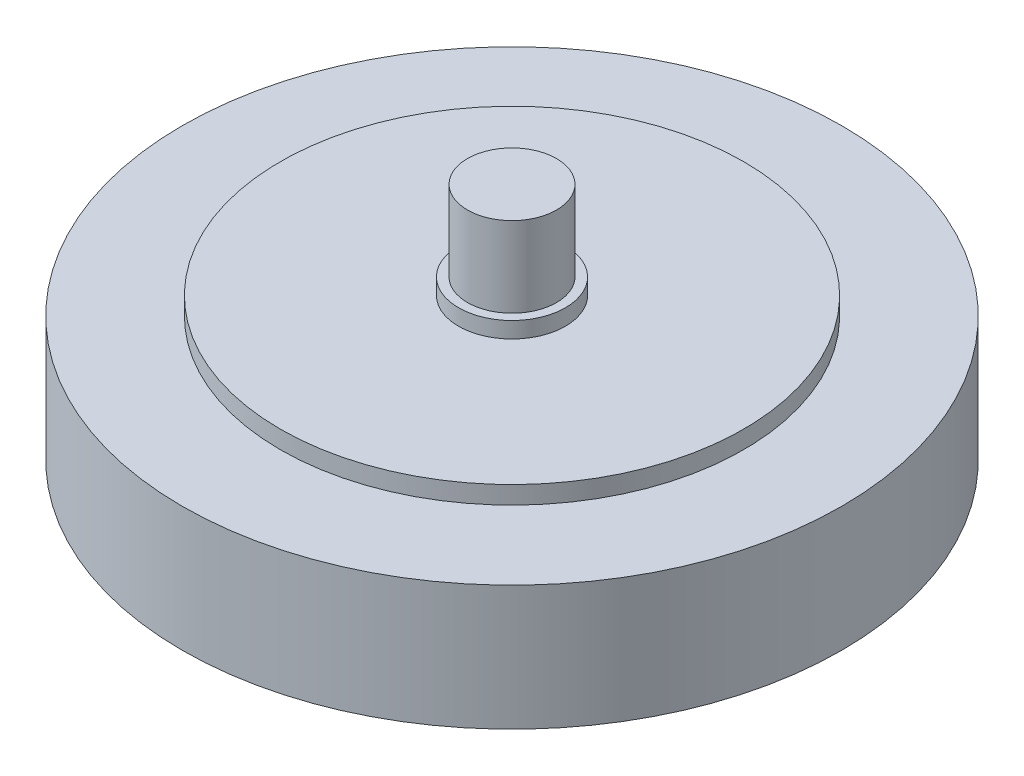
ISO-10303-21;
HEADER;
FILE_DESCRIPTION(('STEP AP214'),'2;1');
FILE_NAME('part.step','',(''),(''),'','','');
FILE_SCHEMA(('AUTOMOTIVE_DESIGN { 1 0 10303 214 1 1 1 1 }'));
ENDSEC;
DATA;
#1=APPLICATION_CONTEXT('core data for automotive mechanical design processes');
#2=APPLICATION_PROTOCOL_DEFINITION('international standard','automotive_design',2000,#1);
#3=PRODUCT_CONTEXT('',#1,'mechanical');
#4=PRODUCT('Part','Part','',(#3));
#5=PRODUCT_RELATED_PRODUCT_CATEGORY('part','',(#4));
#6=PRODUCT_DEFINITION_FORMATION('','',#4);
#7=PRODUCT_DEFINITION_CONTEXT('part definition',#1,'design');
#8=PRODUCT_DEFINITION('design','',#6,#7);
#9=PRODUCT_DEFINITION_SHAPE('','',#8);
#10=(LENGTH_UNIT() NAMED_UNIT(*) SI_UNIT(.MILLI.,.METRE.));
#11=(NAMED_UNIT(*) PLANE_ANGLE_UNIT() SI_UNIT($,.RADIAN.));
#12=(NAMED_UNIT(*) SI_UNIT($,.STERADIAN.) SOLID_ANGLE_UNIT());
#13=UNCERTAINTY_MEASURE_WITH_UNIT(LENGTH_MEASURE(1.E-05),#10,'distance_accuracy_value','');
#14=(GEOMETRIC_REPRESENTATION_CONTEXT(3) GLOBAL_UNCERTAINTY_ASSIGNED_CONTEXT((#13)) GLOBAL_UNIT_ASSIGNED_CONTEXT((#10,
#11,#12)) REPRESENTATION_CONTEXT('',''));
#15=CARTESIAN_POINT('',(0.,0.,0.));
#16=DIRECTION('',(0.,0.,1.));
#17=DIRECTION('',(1.,0.,0.));
#18=AXIS2_PLACEMENT_3D('',#15,#16,#17);
#19=CARTESIAN_POINT('',(0.,0.,0.));
#20=DIRECTION('',(0.,-1.,0.));
#21=DIRECTION('',(0.,0.,-1.));
#22=AXIS2_PLACEMENT_3D('',#19,#20,#21);
#23=PLANE('',#22);
#24=CARTESIAN_POINT('',(0.,0.,0.));
#25=DIRECTION('',(0.,-1.,0.));
#26=DIRECTION('',(0.,0.,-1.));
#27=AXIS2_PLACEMENT_3D('',#24,#25,#26);
#28=CIRCLE('',#27,18.5);
#29=CARTESIAN_POINT('',(0.,0.,-18.5));
#30=VERTEX_POINT('',#29);
#31=EDGE_CURVE('E10',#30,#30,#28,.T.);
#32=ORIENTED_EDGE('',*,*,#31,.T.);
#33=EDGE_LOOP('',(#32));
#34=FACE_BOUND('',#33,.T.);
#35=ADVANCED_FACE('F37',(#34),#23,.T.);
#36=CARTESIAN_POINT('',(0.,0.,0.));
#37=DIRECTION('',(0.,-1.,0.));
#38=DIRECTION('',(0.,0.,-1.));
#39=AXIS2_PLACEMENT_3D('',#36,#37,#38);
#40=CYLINDRICAL_SURFACE('',#39,18.5);
#41=CARTESIAN_POINT('',(0.,7.,0.));
#42=DIRECTION('',(0.,-1.,0.));
#43=DIRECTION('',(0.,0.,-1.));
#44=AXIS2_PLACEMENT_3D('',#41,#42,#43);
#45=CIRCLE('',#44,18.5);
#46=CARTESIAN_POINT('',(0.,7.,-18.5));
#47=VERTEX_POINT('',#46);
#48=EDGE_CURVE('E43',#47,#47,#45,.T.);
#49=ORIENTED_EDGE('',*,*,#48,.T.);
#50=EDGE_LOOP('',(#49));
#51=FACE_BOUND('',#50,.T.);
#52=ORIENTED_EDGE('',*,*,#31,.F.);
#53=EDGE_LOOP('',(#52));
#54=FACE_BOUND('',#53,.T.);
#55=ADVANCED_FACE('F81',(#51,#54),#40,.T.);
#56=CARTESIAN_POINT('',(18.5,7.,0.));
#57=DIRECTION('',(0.,1.,0.));
#58=DIRECTION('',(0.,0.,1.));
#59=AXIS2_PLACEMENT_3D('',#56,#57,#58);
#60=PLANE('',#59);
#61=CARTESIAN_POINT('',(0.,7.,0.));
#62=DIRECTION('',(0.,-1.,0.));
#63=DIRECTION('',(0.,0.,-1.));
#64=AXIS2_PLACEMENT_3D('',#61,#62,#63);
#65=CIRCLE('',#64,13.);
#66=CARTESIAN_POINT('',(0.,7.,-13.));
#67=VERTEX_POINT('',#66);
#68=EDGE_CURVE('E47',#67,#67,#65,.T.);
#69=ORIENTED_EDGE('',*,*,#68,.T.);
#70=EDGE_LOOP('',(#69));
#71=FACE_BOUND('',#70,.T.);
#72=ORIENTED_EDGE('',*,*,#48,.F.);
#73=EDGE_LOOP('',(#72));
#74=FACE_BOUND('',#73,.T.);
#75=ADVANCED_FACE('F85',(#71,#74),#60,.T.);
#76=CARTESIAN_POINT('',(0.,0.,0.));
#77=DIRECTION('',(0.,-1.,0.));
#78=DIRECTION('',(0.,0.,-1.));
#79=AXIS2_PLACEMENT_3D('',#76,#77,#78);
#80=CYLINDRICAL_SURFACE('',#79,13.);
#81=CARTESIAN_POINT('',(0.,8.,0.));
#82=DIRECTION('',(0.,-1.,0.));
#83=DIRECTION('',(0.,0.,-1.));
#84=AXIS2_PLACEMENT_3D('',#81,#82,#83);
#85=CIRCLE('',#84,13.);
#86=CARTESIAN_POINT('',(0.,8.,-13.));
#87=VERTEX_POINT('',#86);
#88=EDGE_CURVE('E51',#87,#87,#85,.T.);
#89=ORIENTED_EDGE('',*,*,#88,.T.);
#90=EDGE_LOOP('',(#89));
#91=FACE_BOUND('',#90,.T.);
#92=ORIENTED_EDGE('',*,*,#68,.F.);
#93=EDGE_LOOP('',(#92));
#94=FACE_BOUND('',#93,.T.);
#95=ADVANCED_FACE('F89',(#91,#94),#80,.T.);
#96=CARTESIAN_POINT('',(13.,8.,0.));
#97=DIRECTION('',(0.,1.,0.));
#98=DIRECTION('',(0.,0.,1.));
#99=AXIS2_PLACEMENT_3D('',#96,#97,#98);
#100=PLANE('',#99);
#101=CARTESIAN_POINT('',(0.,8.,0.));
#102=DIRECTION('',(0.,-1.,0.));
#103=DIRECTION('',(0.,0.,-1.));
#104=AXIS2_PLACEMENT_3D('',#101,#102,#103);
#105=CIRCLE('',#104,3.);
#106=CARTESIAN_POINT('',(0.,8.,-3.));
#107=VERTEX_POINT('',#106);
#108=EDGE_CURVE('E56',#107,#107,#105,.T.);
#109=ORIENTED_EDGE('',*,*,#108,.T.);
#110=EDGE_LOOP('',(#109));
#111=FACE_BOUND('',#110,.T.);
#112=ORIENTED_EDGE('',*,*,#88,.F.);
#113=EDGE_LOOP('',(#112));
#114=FACE_BOUND('',#113,.T.);
#115=ADVANCED_FACE('F96',(#111,#114),#100,.T.);
#116=CARTESIAN_POINT('',(0.,0.,0.));
#117=DIRECTION('',(0.,-1.,0.));
#118=DIRECTION('',(0.,0.,-1.));
#119=AXIS2_PLACEMENT_3D('',#116,#117,#118);
#120=CYLINDRICAL_SURFACE('',#119,3.);
#121=CARTESIAN_POINT('',(0.,8.9,0.));
#122=DIRECTION('',(0.,-1.,0.));
#123=DIRECTION('',(0.,0.,-1.));
#124=AXIS2_PLACEMENT_3D('',#121,#122,#123);
#125=CIRCLE('',#124,3.);
#126=CARTESIAN_POINT('',(0.,8.9,-3.));
#127=VERTEX_POINT('',#126);
#128=EDGE_CURVE('E59',#127,#127,#125,.T.);
#129=ORIENTED_EDGE('',*,*,#128,.T.);
#130=EDGE_LOOP('',(#129));
#131=FACE_BOUND('',#130,.T.);
#132=ORIENTED_EDGE('',*,*,#108,.F.);
#133=EDGE_LOOP('',(#132));
#134=FACE_BOUND('',#133,.T.);
#135=ADVANCED_FACE('F100',(#131,#134),#120,.T.);
#136=CARTESIAN_POINT('',(3.,8.9,0.));
#137=DIRECTION('',(0.,1.,0.));
#138=DIRECTION('',(0.,0.,1.));
#139=AXIS2_PLACEMENT_3D('',#136,#137,#138);
#140=PLANE('',#139);
#141=CARTESIAN_POINT('',(0.,8.9,0.));
#142=DIRECTION('',(0.,-1.,0.));
#143=DIRECTION('',(0.,0.,-1.));
#144=AXIS2_PLACEMENT_3D('',#141,#142,#143);
#145=CIRCLE('',#144,2.5);
#146=CARTESIAN_POINT('',(0.,8.9,-2.5));
#147=VERTEX_POINT('',#146);
#148=EDGE_CURVE('E62',#147,#147,#145,.T.);
#149=ORIENTED_EDGE('',*,*,#148,.T.);
#150=EDGE_LOOP('',(#149));
#151=FACE_BOUND('',#150,.T.);
#152=ORIENTED_EDGE('',*,*,#128,.F.);
#153=EDGE_LOOP('',(#152));
#154=FACE_BOUND('',#153,.T.);
#155=ADVANCED_FACE('F78',(#151,#154),#140,.T.);
#156=CARTESIAN_POINT('',(0.,0.,0.));
#157=DIRECTION('',(0.,-1.,0.));
#158=DIRECTION('',(0.,0.,-1.));
#159=AXIS2_PLACEMENT_3D('',#156,#157,#158);
#160=CYLINDRICAL_SURFACE('',#159,2.5);
#161=CARTESIAN_POINT('',(0.,13.4,0.));
#162=DIRECTION('',(0.,-1.,0.));
#163=DIRECTION('',(0.,0.,-1.));
#164=AXIS2_PLACEMENT_3D('',#161,#162,#163);
#165=CIRCLE('',#164,2.5);
#166=CARTESIAN_POINT('',(0.,13.4,-2.5));
#167=VERTEX_POINT('',#166);
#168=EDGE_CURVE('E65',#167,#167,#165,.T.);
#169=ORIENTED_EDGE('',*,*,#168,.T.);
#170=EDGE_LOOP('',(#169));
#171=FACE_BOUND('',#170,.T.);
#172=ORIENTED_EDGE('',*,*,#148,.F.);
#173=EDGE_LOOP('',(#172));
#174=FACE_BOUND('',#173,.T.);
#175=ADVANCED_FACE('F69',(#171,#174),#160,.T.);
#176=CARTESIAN_POINT('',(2.5,13.4,0.));
#177=DIRECTION('',(0.,1.,0.));
#178=DIRECTION('',(0.,0.,1.));
#179=AXIS2_PLACEMENT_3D('',#176,#177,#178);
#180=PLANE('',#179);
#181=ORIENTED_EDGE('',*,*,#168,.F.);
#182=EDGE_LOOP('',(#181));
#183=FACE_BOUND('',#182,.T.);
#184=ADVANCED_FACE('F72',(#183),#180,.T.);
#185=CLOSED_SHELL('',(#35,#55,#75,#95,#115,#135,#155,#175,#184));
#186=MANIFOLD_SOLID_BREP('B2',#185);
#187=ADVANCED_BREP_SHAPE_REPRESENTATION('',(#18,#186),#14);
#188=SHAPE_DEFINITION_REPRESENTATION(#9,#187);
ENDSEC;
END-ISO-10303-21;
